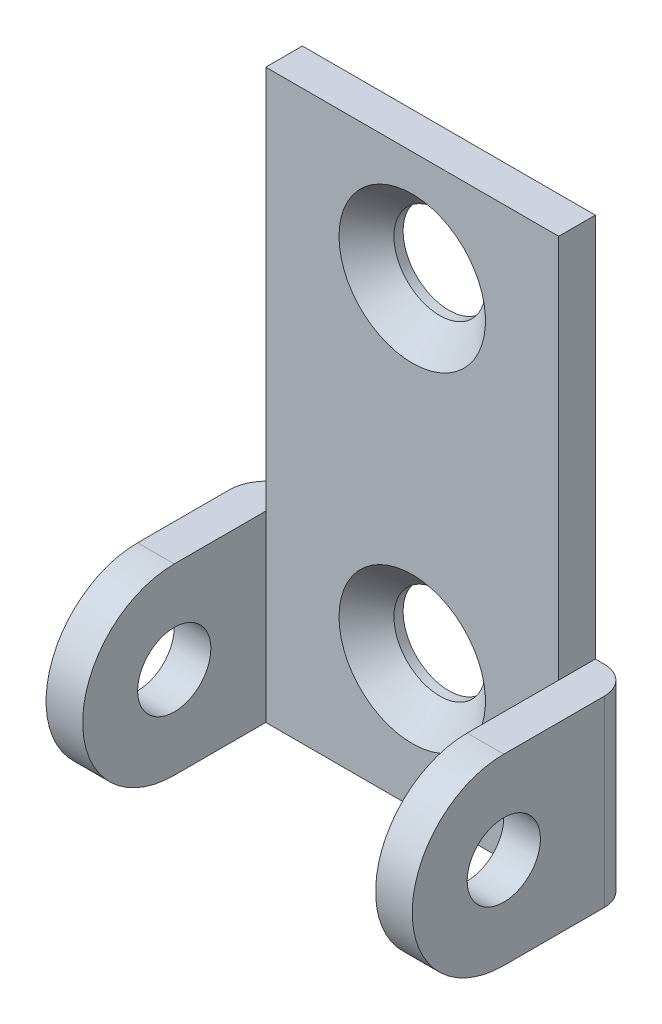
ISO-10303-21;
HEADER;
FILE_DESCRIPTION(('STEP AP214'),'2;1');
FILE_NAME('part.step','',(''),(''),'','','');
FILE_SCHEMA(('AUTOMOTIVE_DESIGN { 1 0 10303 214 1 1 1 1 }'));
ENDSEC;
DATA;
#1=APPLICATION_CONTEXT('core data for automotive mechanical design processes');
#2=APPLICATION_PROTOCOL_DEFINITION('international standard','automotive_design',2000,#1);
#3=PRODUCT_CONTEXT('',#1,'mechanical');
#4=PRODUCT('Part','Part','',(#3));
#5=PRODUCT_RELATED_PRODUCT_CATEGORY('part','',(#4));
#6=PRODUCT_DEFINITION_FORMATION('','',#4);
#7=PRODUCT_DEFINITION_CONTEXT('part definition',#1,'design');
#8=PRODUCT_DEFINITION('design','',#6,#7);
#9=PRODUCT_DEFINITION_SHAPE('','',#8);
#10=(LENGTH_UNIT() NAMED_UNIT(*) SI_UNIT(.MILLI.,.METRE.));
#11=(NAMED_UNIT(*) PLANE_ANGLE_UNIT() SI_UNIT($,.RADIAN.));
#12=(NAMED_UNIT(*) SI_UNIT($,.STERADIAN.) SOLID_ANGLE_UNIT());
#13=UNCERTAINTY_MEASURE_WITH_UNIT(LENGTH_MEASURE(1.E-05),#10,'distance_accuracy_value','');
#14=(GEOMETRIC_REPRESENTATION_CONTEXT(3) GLOBAL_UNCERTAINTY_ASSIGNED_CONTEXT((#13)) GLOBAL_UNIT_ASSIGNED_CONTEXT((#10,
#11,#12)) REPRESENTATION_CONTEXT('',''));
#15=CARTESIAN_POINT('',(0.,0.,0.));
#16=DIRECTION('',(0.,0.,1.));
#17=DIRECTION('',(1.,0.,0.));
#18=AXIS2_PLACEMENT_3D('',#15,#16,#17);
#19=CARTESIAN_POINT('',(2.53130849614536E-13,-1.075139977047E-11,0.));
#20=DIRECTION('',(0.,0.,1.));
#21=DIRECTION('',(1.,0.,0.));
#22=AXIS2_PLACEMENT_3D('',#19,#20,#21);
#23=PLANE('',#22);
#24=CARTESIAN_POINT('',(2.86021202457008E-13,9.49999999998925,0.));
#25=DIRECTION('',(0.,0.,1.));
#26=DIRECTION('',(1.,0.,0.));
#27=AXIS2_PLACEMENT_3D('',#24,#25,#26);
#28=CIRCLE('',#27,2.5);
#29=CARTESIAN_POINT('',(-2.49999999999971,9.49999999998925,0.));
#30=VERTEX_POINT('',#29);
#31=EDGE_CURVE('E213',#30,#30,#28,.T.);
#32=ORIENTED_EDGE('',*,*,#31,.T.);
#33=EDGE_LOOP('',(#32));
#34=FACE_BOUND('',#33,.T.);
#35=CARTESIAN_POINT('',(0.,-8.50000000001075,0.));
#36=DIRECTION('',(0.,0.,1.));
#37=DIRECTION('',(1.,0.,0.));
#38=AXIS2_PLACEMENT_3D('',#35,#36,#37);
#39=CIRCLE('',#38,2.5);
#40=CARTESIAN_POINT('',(-2.5,-8.50000000001075,0.));
#41=VERTEX_POINT('',#40);
#42=EDGE_CURVE('E207',#41,#41,#39,.T.);
#43=ORIENTED_EDGE('',*,*,#42,.T.);
#44=EDGE_LOOP('',(#43));
#45=FACE_BOUND('',#44,.T.);
#46=DIRECTION('',(0.,-1.,0.));
#47=VECTOR('',#46,1.);
#48=CARTESIAN_POINT('',(-7.99999999999975,-2.75000000001075,0.));
#49=LINE('',#48,#47);
#50=CARTESIAN_POINT('',(-7.99999999999975,-5.50000000001075,0.));
#51=VERTEX_POINT('',#50);
#52=CARTESIAN_POINT('',(-7.99999999999975,-15.5000000000108,0.));
#53=VERTEX_POINT('',#52);
#54=EDGE_CURVE('E337',#51,#53,#49,.T.);
#55=ORIENTED_EDGE('',*,*,#54,.F.);
#56=DIRECTION('',(0.,1.,0.));
#57=VECTOR('',#56,1.);
#58=CARTESIAN_POINT('',(-7.99999999999975,-15.5000000000108,0.));
#59=LINE('',#58,#57);
#60=CARTESIAN_POINT('',(-7.99999999999975,15.4999999999892,0.));
#61=VERTEX_POINT('',#60);
#62=EDGE_CURVE('E231',#51,#61,#59,.T.);
#63=ORIENTED_EDGE('',*,*,#62,.T.);
#64=DIRECTION('',(1.,0.,0.));
#65=VECTOR('',#64,1.);
#66=CARTESIAN_POINT('',(-7.99999999999975,15.4999999999892,0.));
#67=LINE('',#66,#65);
#68=CARTESIAN_POINT('',(8.00000000000026,15.4999999999892,0.));
#69=VERTEX_POINT('',#68);
#70=EDGE_CURVE('E52',#61,#69,#67,.T.);
#71=ORIENTED_EDGE('',*,*,#70,.T.);
#72=DIRECTION('',(0.,-1.,0.));
#73=VECTOR('',#72,1.);
#74=CARTESIAN_POINT('',(8.00000000000026,15.4999999999892,0.));
#75=LINE('',#74,#73);
#76=CARTESIAN_POINT('',(8.00000000000026,-5.50000000001075,0.));
#77=VERTEX_POINT('',#76);
#78=EDGE_CURVE('E328',#69,#77,#75,.T.);
#79=ORIENTED_EDGE('',*,*,#78,.T.);
#80=DIRECTION('',(-1.,0.,0.));
#81=VECTOR('',#80,1.);
#82=CARTESIAN_POINT('',(10.0000000000003,-5.50000000001075,0.));
#83=LINE('',#82,#81);
#84=CARTESIAN_POINT('',(8.50000000000026,-5.50000000001075,0.));
#85=VERTEX_POINT('',#84);
#86=EDGE_CURVE('E234',#85,#77,#83,.T.);
#87=ORIENTED_EDGE('',*,*,#86,.F.);
#88=DIRECTION('',(0.,1.,0.));
#89=VECTOR('',#88,1.);
#90=CARTESIAN_POINT('',(8.50000000000026,-7.75000000001075,0.));
#91=LINE('',#90,#89);
#92=CARTESIAN_POINT('',(8.50000000000025,-15.5000000000108,0.));
#93=VERTEX_POINT('',#92);
#94=EDGE_CURVE('E271',#93,#85,#91,.T.);
#95=ORIENTED_EDGE('',*,*,#94,.F.);
#96=DIRECTION('',(-1.,0.,0.));
#97=VECTOR('',#96,1.);
#98=CARTESIAN_POINT('',(-7.99999999999975,-15.5000000000108,0.));
#99=LINE('',#98,#97);
#100=EDGE_CURVE('E301',#93,#53,#99,.T.);
#101=ORIENTED_EDGE('',*,*,#100,.T.);
#102=EDGE_LOOP('',(#55,#63,#71,#79,#87,#95,#101));
#103=FACE_BOUND('',#102,.T.);
#104=ADVANCED_FACE('F41',(#34,#45,#103),#23,.F.);
#105=CARTESIAN_POINT('',(2.53130849614536E-13,-1.075139977047E-11,2.));
#106=DIRECTION('',(0.,0.,1.));
#107=DIRECTION('',(1.,0.,0.));
#108=AXIS2_PLACEMENT_3D('',#105,#106,#107);
#109=PLANE('',#108);
#110=CARTESIAN_POINT('',(2.86021202457008E-13,9.49999999998925,2.));
#111=DIRECTION('',(0.,0.,-1.));
#112=DIRECTION('',(1.,0.,0.));
#113=AXIS2_PLACEMENT_3D('',#110,#111,#112);
#114=CIRCLE('',#113,4.);
#115=CARTESIAN_POINT('',(-3.99999999999971,9.49999999998925,2.));
#116=VERTEX_POINT('',#115);
#117=EDGE_CURVE('E211',#116,#116,#114,.T.);
#118=ORIENTED_EDGE('',*,*,#117,.T.);
#119=EDGE_LOOP('',(#118));
#120=FACE_BOUND('',#119,.T.);
#121=CARTESIAN_POINT('',(0.,-8.50000000001075,2.));
#122=DIRECTION('',(0.,0.,-1.));
#123=DIRECTION('',(1.,0.,0.));
#124=AXIS2_PLACEMENT_3D('',#121,#122,#123);
#125=CIRCLE('',#124,4.);
#126=CARTESIAN_POINT('',(-4.,-8.50000000001075,2.));
#127=VERTEX_POINT('',#126);
#128=EDGE_CURVE('E196',#127,#127,#125,.T.);
#129=ORIENTED_EDGE('',*,*,#128,.T.);
#130=EDGE_LOOP('',(#129));
#131=FACE_BOUND('',#130,.T.);
#132=DIRECTION('',(-1.,0.,0.));
#133=VECTOR('',#132,1.);
#134=CARTESIAN_POINT('',(-7.99999999999975,15.4999999999892,2.));
#135=LINE('',#134,#133);
#136=CARTESIAN_POINT('',(8.00000000000026,15.4999999999892,2.));
#137=VERTEX_POINT('',#136);
#138=CARTESIAN_POINT('',(-7.99999999999975,15.4999999999892,2.));
#139=VERTEX_POINT('',#138);
#140=EDGE_CURVE('E11',#137,#139,#135,.T.);
#141=ORIENTED_EDGE('',*,*,#140,.T.);
#142=DIRECTION('',(0.,-1.,0.));
#143=VECTOR('',#142,1.);
#144=CARTESIAN_POINT('',(-7.99999999999975,-15.5000000000108,2.));
#145=LINE('',#144,#143);
#146=CARTESIAN_POINT('',(-7.99999999999975,-5.50000000001075,2.));
#147=VERTEX_POINT('',#146);
#148=EDGE_CURVE('E182',#139,#147,#145,.T.);
#149=ORIENTED_EDGE('',*,*,#148,.T.);
#150=DIRECTION('',(0.,-1.,0.));
#151=VECTOR('',#150,1.);
#152=CARTESIAN_POINT('',(-7.99999999999975,-15.5000000000108,2.));
#153=LINE('',#152,#151);
#154=CARTESIAN_POINT('',(-7.99999999999975,-15.5000000000108,2.));
#155=VERTEX_POINT('',#154);
#156=EDGE_CURVE('E159',#147,#155,#153,.T.);
#157=ORIENTED_EDGE('',*,*,#156,.T.);
#158=DIRECTION('',(1.,0.,0.));
#159=VECTOR('',#158,1.);
#160=CARTESIAN_POINT('',(8.00000000000026,-15.5000000000108,2.));
#161=LINE('',#160,#159);
#162=CARTESIAN_POINT('',(8.00000000000026,-15.5000000000108,2.));
#163=VERTEX_POINT('',#162);
#164=EDGE_CURVE('E170',#155,#163,#161,.T.);
#165=ORIENTED_EDGE('',*,*,#164,.T.);
#166=DIRECTION('',(0.,1.,0.));
#167=VECTOR('',#166,1.);
#168=CARTESIAN_POINT('',(8.00000000000026,15.4999999999892,2.));
#169=LINE('',#168,#167);
#170=CARTESIAN_POINT('',(8.00000000000026,-5.50000000001075,2.));
#171=VERTEX_POINT('',#170);
#172=EDGE_CURVE('E274',#163,#171,#169,.T.);
#173=ORIENTED_EDGE('',*,*,#172,.T.);
#174=DIRECTION('',(0.,1.,0.));
#175=VECTOR('',#174,1.);
#176=CARTESIAN_POINT('',(8.00000000000026,15.4999999999892,2.));
#177=LINE('',#176,#175);
#178=EDGE_CURVE('E192',#171,#137,#177,.T.);
#179=ORIENTED_EDGE('',*,*,#178,.T.);
#180=EDGE_LOOP('',(#141,#149,#157,#165,#173,#179));
#181=FACE_BOUND('',#180,.T.);
#182=ADVANCED_FACE('F181',(#120,#131,#181),#109,.T.);
#183=CARTESIAN_POINT('',(8.00000000000026,15.4999999999892,0.));
#184=DIRECTION('',(0.,1.,0.));
#185=DIRECTION('',(1.,0.,0.));
#186=AXIS2_PLACEMENT_3D('',#183,#184,#185);
#187=PLANE('',#186);
#188=ORIENTED_EDGE('',*,*,#70,.F.);
#189=DIRECTION('',(0.,0.,1.));
#190=VECTOR('',#189,1.);
#191=CARTESIAN_POINT('',(-7.99999999999975,15.4999999999892,0.));
#192=LINE('',#191,#190);
#193=EDGE_CURVE('E61',#61,#139,#192,.T.);
#194=ORIENTED_EDGE('',*,*,#193,.T.);
#195=ORIENTED_EDGE('',*,*,#140,.F.);
#196=DIRECTION('',(0.,0.,1.));
#197=VECTOR('',#196,1.);
#198=CARTESIAN_POINT('',(8.00000000000026,15.4999999999892,0.));
#199=LINE('',#198,#197);
#200=EDGE_CURVE('E197',#69,#137,#199,.T.);
#201=ORIENTED_EDGE('',*,*,#200,.F.);
#202=EDGE_LOOP('',(#188,#194,#195,#201));
#203=FACE_BOUND('',#202,.T.);
#204=ADVANCED_FACE('F392',(#203),#187,.T.);
#205=CARTESIAN_POINT('',(-7.99999999999975,15.4999999999892,0.));
#206=DIRECTION('',(-1.,0.,0.));
#207=DIRECTION('',(0.,0.,1.));
#208=AXIS2_PLACEMENT_3D('',#205,#206,#207);
#209=PLANE('',#208);
#210=DIRECTION('',(0.,0.,1.));
#211=VECTOR('',#210,1.);
#212=CARTESIAN_POINT('',(-7.99999999999975,-5.50000000001075,0.));
#213=LINE('',#212,#211);
#214=EDGE_CURVE('E288',#51,#147,#213,.T.);
#215=ORIENTED_EDGE('',*,*,#214,.T.);
#216=ORIENTED_EDGE('',*,*,#148,.F.);
#217=ORIENTED_EDGE('',*,*,#193,.F.);
#218=ORIENTED_EDGE('',*,*,#62,.F.);
#219=EDGE_LOOP('',(#215,#216,#217,#218));
#220=FACE_BOUND('',#219,.T.);
#221=ADVANCED_FACE('F43',(#220),#209,.T.);
#222=CARTESIAN_POINT('',(2.86021202457008E-13,9.49999999998925,-8.5));
#223=DIRECTION('',(0.,0.,-1.));
#224=DIRECTION('',(1.,0.,0.));
#225=AXIS2_PLACEMENT_3D('',#222,#223,#224);
#226=CYLINDRICAL_SURFACE('',#225,2.5);
#227=CARTESIAN_POINT('',(2.86021202457008E-13,9.49999999998925,0.5));
#228=DIRECTION('',(0.,0.,-1.));
#229=DIRECTION('',(1.,0.,0.));
#230=AXIS2_PLACEMENT_3D('',#227,#228,#229);
#231=CIRCLE('',#230,2.5);
#232=CARTESIAN_POINT('',(-2.49999999999971,9.49999999998925,0.5));
#233=VERTEX_POINT('',#232);
#234=EDGE_CURVE('E250',#233,#233,#231,.T.);
#235=ORIENTED_EDGE('',*,*,#234,.F.);
#236=DIRECTION('',(0.,0.,-1.));
#237=VECTOR('',#236,1.);
#238=CARTESIAN_POINT('',(-2.49999999999971,9.49999999998925,-8.5));
#239=LINE('',#238,#237);
#240=EDGE_CURVE('E217',#233,#30,#239,.T.);
#241=ORIENTED_EDGE('',*,*,#240,.T.);
#242=ORIENTED_EDGE('',*,*,#31,.F.);
#243=ORIENTED_EDGE('',*,*,#240,.F.);
#244=EDGE_LOOP('',(#235,#241,#242,#243));
#245=FACE_BOUND('',#244,.T.);
#246=ADVANCED_FACE('F456',(#245),#226,.F.);
#247=CARTESIAN_POINT('',(2.86021202457008E-13,9.49999999998925,1.25));
#248=DIRECTION('',(0.,0.,1.));
#249=DIRECTION('',(1.,0.,0.));
#250=AXIS2_PLACEMENT_3D('',#247,#248,#249);
#251=CONICAL_SURFACE('',#250,3.25,0.785398163397448);
#252=ORIENTED_EDGE('',*,*,#117,.F.);
#253=DIRECTION('',(0.707106781186547,0.,-0.707106781186548));
#254=VECTOR('',#253,1.);
#255=CARTESIAN_POINT('',(-3.24999999999971,9.49999999998925,1.25));
#256=LINE('',#255,#254);
#257=EDGE_CURVE('E190',#116,#233,#256,.T.);
#258=ORIENTED_EDGE('',*,*,#257,.T.);
#259=ORIENTED_EDGE('',*,*,#234,.T.);
#260=ORIENTED_EDGE('',*,*,#257,.F.);
#261=EDGE_LOOP('',(#252,#258,#259,#260));
#262=FACE_BOUND('',#261,.T.);
#263=ADVANCED_FACE('F436',(#262),#251,.F.);
#264=CARTESIAN_POINT('',(0.,-8.50000000001075,-8.5));
#265=DIRECTION('',(0.,0.,-1.));
#266=DIRECTION('',(1.,0.,0.));
#267=AXIS2_PLACEMENT_3D('',#264,#265,#266);
#268=CYLINDRICAL_SURFACE('',#267,2.5);
#269=CARTESIAN_POINT('',(0.,-8.50000000001075,0.5));
#270=DIRECTION('',(0.,0.,-1.));
#271=DIRECTION('',(1.,0.,0.));
#272=AXIS2_PLACEMENT_3D('',#269,#270,#271);
#273=CIRCLE('',#272,2.5);
#274=CARTESIAN_POINT('',(-2.5,-8.50000000001075,0.5));
#275=VERTEX_POINT('',#274);
#276=EDGE_CURVE('E243',#275,#275,#273,.T.);
#277=ORIENTED_EDGE('',*,*,#276,.F.);
#278=DIRECTION('',(0.,0.,-1.));
#279=VECTOR('',#278,1.);
#280=CARTESIAN_POINT('',(-2.5,-8.50000000001075,-8.5));
#281=LINE('',#280,#279);
#282=EDGE_CURVE('E212',#275,#41,#281,.T.);
#283=ORIENTED_EDGE('',*,*,#282,.T.);
#284=ORIENTED_EDGE('',*,*,#42,.F.);
#285=ORIENTED_EDGE('',*,*,#282,.F.);
#286=EDGE_LOOP('',(#277,#283,#284,#285));
#287=FACE_BOUND('',#286,.T.);
#288=ADVANCED_FACE('F440',(#287),#268,.F.);
#289=CARTESIAN_POINT('',(0.,-8.50000000001075,1.25));
#290=DIRECTION('',(0.,0.,1.));
#291=DIRECTION('',(1.,0.,0.));
#292=AXIS2_PLACEMENT_3D('',#289,#290,#291);
#293=CONICAL_SURFACE('',#292,3.25,0.785398163397448);
#294=ORIENTED_EDGE('',*,*,#128,.F.);
#295=DIRECTION('',(0.707106781186547,0.,-0.707106781186548));
#296=VECTOR('',#295,1.);
#297=CARTESIAN_POINT('',(-3.25,-8.50000000001075,1.25));
#298=LINE('',#297,#296);
#299=EDGE_CURVE('E240',#127,#275,#298,.T.);
#300=ORIENTED_EDGE('',*,*,#299,.T.);
#301=ORIENTED_EDGE('',*,*,#276,.T.);
#302=ORIENTED_EDGE('',*,*,#299,.F.);
#303=EDGE_LOOP('',(#294,#300,#301,#302));
#304=FACE_BOUND('',#303,.T.);
#305=ADVANCED_FACE('F438',(#304),#293,.F.);
#306=CARTESIAN_POINT('',(8.00000000000026,-15.5000000000108,0.));
#307=DIRECTION('',(1.,0.,0.));
#308=DIRECTION('',(0.,1.,0.));
#309=AXIS2_PLACEMENT_3D('',#306,#307,#308);
#310=PLANE('',#309);
#311=DIRECTION('',(0.,0.,-1.));
#312=VECTOR('',#311,1.);
#313=CARTESIAN_POINT('',(8.00000000000026,-5.50000000001075,0.));
#314=LINE('',#313,#312);
#315=EDGE_CURVE('E238',#171,#77,#314,.T.);
#316=ORIENTED_EDGE('',*,*,#315,.T.);
#317=ORIENTED_EDGE('',*,*,#78,.F.);
#318=ORIENTED_EDGE('',*,*,#200,.T.);
#319=ORIENTED_EDGE('',*,*,#178,.F.);
#320=EDGE_LOOP('',(#316,#317,#318,#319));
#321=FACE_BOUND('',#320,.T.);
#322=ADVANCED_FACE('F389',(#321),#310,.T.);
#323=CARTESIAN_POINT('',(10.0000000000003,-5.50000000001075,0.));
#324=DIRECTION('',(0.,1.,0.));
#325=DIRECTION('',(1.,0.,0.));
#326=AXIS2_PLACEMENT_3D('',#323,#324,#325);
#327=PLANE('',#326);
#328=DIRECTION('',(-1.,0.,0.));
#329=VECTOR('',#328,1.);
#330=CARTESIAN_POINT('',(9.50000000000026,-5.50000000001075,7.));
#331=LINE('',#330,#329);
#332=CARTESIAN_POINT('',(10.0000000000003,-5.50000000001075,7.));
#333=VERTEX_POINT('',#332);
#334=CARTESIAN_POINT('',(8.00000000000026,-5.50000000001075,7.));
#335=VERTEX_POINT('',#334);
#336=EDGE_CURVE('E256',#333,#335,#331,.T.);
#337=ORIENTED_EDGE('',*,*,#336,.F.);
#338=DIRECTION('',(0.,0.,1.));
#339=VECTOR('',#338,1.);
#340=CARTESIAN_POINT('',(10.0000000000003,-5.50000000001075,0.));
#341=LINE('',#340,#339);
#342=CARTESIAN_POINT('',(10.0000000000003,-5.50000000001075,1.5));
#343=VERTEX_POINT('',#342);
#344=EDGE_CURVE('E239',#343,#333,#341,.T.);
#345=ORIENTED_EDGE('',*,*,#344,.F.);
#346=CARTESIAN_POINT('',(8.50000000000026,-5.50000000001075,1.5));
#347=DIRECTION('',(0.,-1.,0.));
#348=DIRECTION('',(0.707106781186548,0.,-0.707106781186547));
#349=AXIS2_PLACEMENT_3D('',#346,#347,#348);
#350=CIRCLE('',#349,1.5);
#351=EDGE_CURVE('E178',#85,#343,#350,.T.);
#352=ORIENTED_EDGE('',*,*,#351,.F.);
#353=ORIENTED_EDGE('',*,*,#86,.T.);
#354=ORIENTED_EDGE('',*,*,#315,.F.);
#355=DIRECTION('',(0.,0.,1.));
#356=VECTOR('',#355,1.);
#357=CARTESIAN_POINT('',(8.00000000000026,-5.50000000001075,0.));
#358=LINE('',#357,#356);
#359=EDGE_CURVE('E187',#171,#335,#358,.T.);
#360=ORIENTED_EDGE('',*,*,#359,.T.);
#361=EDGE_LOOP('',(#337,#345,#352,#353,#354,#360));
#362=FACE_BOUND('',#361,.T.);
#363=ADVANCED_FACE('F363',(#362),#327,.T.);
#364=CARTESIAN_POINT('',(10.0000000000003,-15.5000000000108,0.));
#365=DIRECTION('',(1.,0.,0.));
#366=DIRECTION('',(0.,1.,0.));
#367=AXIS2_PLACEMENT_3D('',#364,#365,#366);
#368=PLANE('',#367);
#369=CARTESIAN_POINT('',(10.0000000000003,-10.5000000000108,7.));
#370=DIRECTION('',(-1.,0.,0.));
#371=DIRECTION('',(0.,1.,0.));
#372=AXIS2_PLACEMENT_3D('',#369,#370,#371);
#373=CIRCLE('',#372,2.);
#374=CARTESIAN_POINT('',(10.0000000000003,-12.5000000000108,7.));
#375=VERTEX_POINT('',#374);
#376=EDGE_CURVE('E260',#375,#375,#373,.T.);
#377=ORIENTED_EDGE('',*,*,#376,.T.);
#378=EDGE_LOOP('',(#377));
#379=FACE_BOUND('',#378,.T.);
#380=CARTESIAN_POINT('',(10.0000000000003,-10.5000000000108,7.));
#381=DIRECTION('',(-1.,0.,0.));
#382=DIRECTION('',(0.,0.707106781186548,0.707106781186548));
#383=AXIS2_PLACEMENT_3D('',#380,#381,#382);
#384=CIRCLE('',#383,5.);
#385=CARTESIAN_POINT('',(10.0000000000003,-15.5000000000108,7.));
#386=VERTEX_POINT('',#385);
#387=EDGE_CURVE('E221',#386,#333,#384,.T.);
#388=ORIENTED_EDGE('',*,*,#387,.F.);
#389=DIRECTION('',(0.,0.,1.));
#390=VECTOR('',#389,1.);
#391=CARTESIAN_POINT('',(10.0000000000003,-15.5000000000108,0.));
#392=LINE('',#391,#390);
#393=CARTESIAN_POINT('',(10.0000000000003,-15.5000000000108,1.5));
#394=VERTEX_POINT('',#393);
#395=EDGE_CURVE('E179',#394,#386,#392,.T.);
#396=ORIENTED_EDGE('',*,*,#395,.F.);
#397=DIRECTION('',(0.,-1.,0.));
#398=VECTOR('',#397,1.);
#399=CARTESIAN_POINT('',(10.0000000000003,-7.75000000001075,1.5));
#400=LINE('',#399,#398);
#401=EDGE_CURVE('E277',#343,#394,#400,.T.);
#402=ORIENTED_EDGE('',*,*,#401,.F.);
#403=ORIENTED_EDGE('',*,*,#344,.T.);
#404=EDGE_LOOP('',(#388,#396,#402,#403));
#405=FACE_BOUND('',#404,.T.);
#406=ADVANCED_FACE('F359',(#379,#405),#368,.T.);
#407=CARTESIAN_POINT('',(8.50000000000026,-7.75000000001075,1.5));
#408=DIRECTION('',(0.,1.,0.));
#409=DIRECTION('',(0.707106781186548,0.,-0.707106781186547));
#410=AXIS2_PLACEMENT_3D('',#407,#408,#409);
#411=CYLINDRICAL_SURFACE('',#410,1.5);
#412=ORIENTED_EDGE('',*,*,#351,.T.);
#413=ORIENTED_EDGE('',*,*,#401,.T.);
#414=CARTESIAN_POINT('',(8.50000000000026,-15.5000000000108,1.5));
#415=DIRECTION('',(0.,1.,0.));
#416=DIRECTION('',(0.707106781186548,0.,-0.707106781186547));
#417=AXIS2_PLACEMENT_3D('',#414,#415,#416);
#418=CIRCLE('',#417,1.5);
#419=EDGE_CURVE('E206',#394,#93,#418,.T.);
#420=ORIENTED_EDGE('',*,*,#419,.T.);
#421=ORIENTED_EDGE('',*,*,#94,.T.);
#422=EDGE_LOOP('',(#412,#413,#420,#421));
#423=FACE_BOUND('',#422,.T.);
#424=ADVANCED_FACE('F362',(#423),#411,.T.);
#425=CARTESIAN_POINT('',(-7.99999999999975,-15.5000000000108,0.));
#426=DIRECTION('',(0.,-1.,0.));
#427=DIRECTION('',(0.,0.,-1.));
#428=AXIS2_PLACEMENT_3D('',#425,#426,#427);
#429=PLANE('',#428);
#430=DIRECTION('',(1.,0.,0.));
#431=VECTOR('',#430,1.);
#432=CARTESIAN_POINT('',(-8.49999999999975,-15.5000000000108,7.));
#433=LINE('',#432,#431);
#434=CARTESIAN_POINT('',(-9.99999999999975,-15.5000000000108,7.));
#435=VERTEX_POINT('',#434);
#436=CARTESIAN_POINT('',(-7.99999999999975,-15.5000000000108,7.));
#437=VERTEX_POINT('',#436);
#438=EDGE_CURVE('E226',#435,#437,#433,.T.);
#439=ORIENTED_EDGE('',*,*,#438,.F.);
#440=DIRECTION('',(0.,0.,1.));
#441=VECTOR('',#440,1.);
#442=CARTESIAN_POINT('',(-9.99999999999975,-15.5000000000108,0.));
#443=LINE('',#442,#441);
#444=CARTESIAN_POINT('',(-9.99999999999975,-15.5000000000108,2.));
#445=VERTEX_POINT('',#444);
#446=EDGE_CURVE('E222',#445,#435,#443,.T.);
#447=ORIENTED_EDGE('',*,*,#446,.F.);
#448=CARTESIAN_POINT('',(-7.99999999999975,-15.5000000000108,2.));
#449=DIRECTION('',(0.,1.,0.));
#450=DIRECTION('',(-0.707106781186547,0.,-0.707106781186548));
#451=AXIS2_PLACEMENT_3D('',#448,#449,#450);
#452=CIRCLE('',#451,2.);
#453=EDGE_CURVE('E308',#53,#445,#452,.T.);
#454=ORIENTED_EDGE('',*,*,#453,.F.);
#455=ORIENTED_EDGE('',*,*,#100,.F.);
#456=ORIENTED_EDGE('',*,*,#419,.F.);
#457=ORIENTED_EDGE('',*,*,#395,.T.);
#458=DIRECTION('',(1.,0.,0.));
#459=VECTOR('',#458,1.);
#460=CARTESIAN_POINT('',(0.500000000000253,-15.5000000000108,7.));
#461=LINE('',#460,#459);
#462=CARTESIAN_POINT('',(8.00000000000026,-15.5000000000108,7.));
#463=VERTEX_POINT('',#462);
#464=EDGE_CURVE('E218',#463,#386,#461,.T.);
#465=ORIENTED_EDGE('',*,*,#464,.F.);
#466=DIRECTION('',(0.,0.,1.));
#467=VECTOR('',#466,1.);
#468=CARTESIAN_POINT('',(8.00000000000026,-15.5000000000108,0.));
#469=LINE('',#468,#467);
#470=EDGE_CURVE('E173',#163,#463,#469,.T.);
#471=ORIENTED_EDGE('',*,*,#470,.F.);
#472=ORIENTED_EDGE('',*,*,#164,.F.);
#473=DIRECTION('',(0.,0.,1.));
#474=VECTOR('',#473,1.);
#475=CARTESIAN_POINT('',(-7.99999999999975,-15.5000000000108,0.));
#476=LINE('',#475,#474);
#477=EDGE_CURVE('E154',#155,#437,#476,.T.);
#478=ORIENTED_EDGE('',*,*,#477,.T.);
#479=EDGE_LOOP('',(#439,#447,#454,#455,#456,#457,#465,#471,#472,#478));
#480=FACE_BOUND('',#479,.T.);
#481=ADVANCED_FACE('F171',(#480),#429,.T.);
#482=CARTESIAN_POINT('',(-7.99999999999975,-2.75000000001075,2.));
#483=DIRECTION('',(0.,1.,0.));
#484=DIRECTION('',(-0.707106781186547,0.,-0.707106781186548));
#485=AXIS2_PLACEMENT_3D('',#482,#483,#484);
#486=CYLINDRICAL_SURFACE('',#485,2.);
#487=ORIENTED_EDGE('',*,*,#453,.T.);
#488=DIRECTION('',(0.,1.,0.));
#489=VECTOR('',#488,1.);
#490=CARTESIAN_POINT('',(-9.99999999999975,-2.75000000001075,2.));
#491=LINE('',#490,#489);
#492=CARTESIAN_POINT('',(-9.99999999999975,-5.50000000001075,2.));
#493=VERTEX_POINT('',#492);
#494=EDGE_CURVE('E227',#445,#493,#491,.T.);
#495=ORIENTED_EDGE('',*,*,#494,.T.);
#496=CARTESIAN_POINT('',(-7.99999999999975,-5.50000000001075,2.));
#497=DIRECTION('',(0.,-1.,0.));
#498=DIRECTION('',(-0.707106781186547,0.,-0.707106781186548));
#499=AXIS2_PLACEMENT_3D('',#496,#497,#498);
#500=CIRCLE('',#499,2.);
#501=EDGE_CURVE('E167',#493,#51,#500,.T.);
#502=ORIENTED_EDGE('',*,*,#501,.T.);
#503=ORIENTED_EDGE('',*,*,#54,.T.);
#504=EDGE_LOOP('',(#487,#495,#502,#503));
#505=FACE_BOUND('',#504,.T.);
#506=ADVANCED_FACE('F404',(#505),#486,.T.);
#507=CARTESIAN_POINT('',(9.50000000000026,-10.5000000000108,7.));
#508=DIRECTION('',(-1.,0.,0.));
#509=DIRECTION('',(0.,0.707106781186548,0.707106781186548));
#510=AXIS2_PLACEMENT_3D('',#507,#508,#509);
#511=CYLINDRICAL_SURFACE('',#510,5.);
#512=CARTESIAN_POINT('',(8.00000000000026,-10.5000000000108,7.));
#513=DIRECTION('',(1.,0.,0.));
#514=DIRECTION('',(0.,-0.707106781186548,0.707106781186548));
#515=AXIS2_PLACEMENT_3D('',#512,#513,#514);
#516=CIRCLE('',#515,5.);
#517=EDGE_CURVE('E45',#335,#463,#516,.T.);
#518=ORIENTED_EDGE('',*,*,#517,.T.);
#519=ORIENTED_EDGE('',*,*,#464,.T.);
#520=ORIENTED_EDGE('',*,*,#387,.T.);
#521=ORIENTED_EDGE('',*,*,#336,.T.);
#522=EDGE_LOOP('',(#518,#519,#520,#521));
#523=FACE_BOUND('',#522,.T.);
#524=ADVANCED_FACE('F371',(#523),#511,.T.);
#525=CARTESIAN_POINT('',(8.00000000000026,-5.50000000001075,0.));
#526=DIRECTION('',(-1.,0.,0.));
#527=DIRECTION('',(0.,0.,1.));
#528=AXIS2_PLACEMENT_3D('',#525,#526,#527);
#529=PLANE('',#528);
#530=CARTESIAN_POINT('',(8.00000000000026,-10.5000000000108,7.));
#531=DIRECTION('',(1.,0.,0.));
#532=DIRECTION('',(0.,1.,0.));
#533=AXIS2_PLACEMENT_3D('',#530,#531,#532);
#534=CIRCLE('',#533,2.);
#535=CARTESIAN_POINT('',(8.00000000000026,-12.5000000000108,7.));
#536=VERTEX_POINT('',#535);
#537=EDGE_CURVE('E267',#536,#536,#534,.T.);
#538=ORIENTED_EDGE('',*,*,#537,.T.);
#539=EDGE_LOOP('',(#538));
#540=FACE_BOUND('',#539,.T.);
#541=ORIENTED_EDGE('',*,*,#517,.F.);
#542=ORIENTED_EDGE('',*,*,#359,.F.);
#543=ORIENTED_EDGE('',*,*,#172,.F.);
#544=ORIENTED_EDGE('',*,*,#470,.T.);
#545=EDGE_LOOP('',(#541,#542,#543,#544));
#546=FACE_BOUND('',#545,.T.);
#547=ADVANCED_FACE('F354',(#540,#546),#529,.T.);
#548=CARTESIAN_POINT('',(-7.99999999999975,-15.5000000000108,0.));
#549=DIRECTION('',(1.,0.,0.));
#550=DIRECTION('',(0.,1.,0.));
#551=AXIS2_PLACEMENT_3D('',#548,#549,#550);
#552=PLANE('',#551);
#553=CARTESIAN_POINT('',(-7.99999999999975,-10.5000000000108,7.));
#554=DIRECTION('',(-1.,0.,0.));
#555=DIRECTION('',(0.,1.,0.));
#556=AXIS2_PLACEMENT_3D('',#553,#554,#555);
#557=CIRCLE('',#556,2.);
#558=CARTESIAN_POINT('',(-7.99999999999975,-12.5000000000108,7.));
#559=VERTEX_POINT('',#558);
#560=EDGE_CURVE('E294',#559,#559,#557,.T.);
#561=ORIENTED_EDGE('',*,*,#560,.T.);
#562=EDGE_LOOP('',(#561));
#563=FACE_BOUND('',#562,.T.);
#564=CARTESIAN_POINT('',(-7.99999999999975,-10.5000000000108,7.));
#565=DIRECTION('',(-1.,0.,0.));
#566=DIRECTION('',(0.,0.707106781186548,0.707106781186548));
#567=AXIS2_PLACEMENT_3D('',#564,#565,#566);
#568=CIRCLE('',#567,5.);
#569=CARTESIAN_POINT('',(-7.99999999999975,-5.50000000001075,7.));
#570=VERTEX_POINT('',#569);
#571=EDGE_CURVE('E162',#437,#570,#568,.T.);
#572=ORIENTED_EDGE('',*,*,#571,.F.);
#573=ORIENTED_EDGE('',*,*,#477,.F.);
#574=ORIENTED_EDGE('',*,*,#156,.F.);
#575=DIRECTION('',(0.,0.,1.));
#576=VECTOR('',#575,1.);
#577=CARTESIAN_POINT('',(-7.99999999999975,-5.50000000001075,0.));
#578=LINE('',#577,#576);
#579=EDGE_CURVE('E202',#147,#570,#578,.T.);
#580=ORIENTED_EDGE('',*,*,#579,.T.);
#581=EDGE_LOOP('',(#572,#573,#574,#580));
#582=FACE_BOUND('',#581,.T.);
#583=ADVANCED_FACE('F156',(#563,#582),#552,.T.);
#584=CARTESIAN_POINT('',(-7.99999999999975,-5.50000000001075,0.));
#585=DIRECTION('',(0.,1.,0.));
#586=DIRECTION('',(1.,0.,0.));
#587=AXIS2_PLACEMENT_3D('',#584,#585,#586);
#588=PLANE('',#587);
#589=DIRECTION('',(-1.,0.,0.));
#590=VECTOR('',#589,1.);
#591=CARTESIAN_POINT('',(-8.49999999999975,-5.50000000001075,7.));
#592=LINE('',#591,#590);
#593=CARTESIAN_POINT('',(-9.99999999999975,-5.50000000001075,7.));
#594=VERTEX_POINT('',#593);
#595=EDGE_CURVE('E198',#570,#594,#592,.T.);
#596=ORIENTED_EDGE('',*,*,#595,.F.);
#597=ORIENTED_EDGE('',*,*,#579,.F.);
#598=ORIENTED_EDGE('',*,*,#214,.F.);
#599=ORIENTED_EDGE('',*,*,#501,.F.);
#600=DIRECTION('',(0.,0.,1.));
#601=VECTOR('',#600,1.);
#602=CARTESIAN_POINT('',(-9.99999999999975,-5.50000000001075,0.));
#603=LINE('',#602,#601);
#604=EDGE_CURVE('E281',#493,#594,#603,.T.);
#605=ORIENTED_EDGE('',*,*,#604,.T.);
#606=EDGE_LOOP('',(#596,#597,#598,#599,#605));
#607=FACE_BOUND('',#606,.T.);
#608=ADVANCED_FACE('F397',(#607),#588,.T.);
#609=CARTESIAN_POINT('',(-8.49999999999975,-10.5000000000108,7.));
#610=DIRECTION('',(-1.,0.,0.));
#611=DIRECTION('',(0.,0.707106781186548,0.707106781186548));
#612=AXIS2_PLACEMENT_3D('',#609,#610,#611);
#613=CYLINDRICAL_SURFACE('',#612,5.);
#614=CARTESIAN_POINT('',(-9.99999999999975,-10.5000000000108,7.));
#615=DIRECTION('',(1.,0.,0.));
#616=DIRECTION('',(0.,-0.707106781186548,0.707106781186548));
#617=AXIS2_PLACEMENT_3D('',#614,#615,#616);
#618=CIRCLE('',#617,5.);
#619=EDGE_CURVE('E285',#594,#435,#618,.T.);
#620=ORIENTED_EDGE('',*,*,#619,.T.);
#621=ORIENTED_EDGE('',*,*,#438,.T.);
#622=ORIENTED_EDGE('',*,*,#571,.T.);
#623=ORIENTED_EDGE('',*,*,#595,.T.);
#624=EDGE_LOOP('',(#620,#621,#622,#623));
#625=FACE_BOUND('',#624,.T.);
#626=ADVANCED_FACE('F399',(#625),#613,.T.);
#627=CARTESIAN_POINT('',(-9.99999999999975,-5.50000000001075,0.));
#628=DIRECTION('',(-1.,0.,0.));
#629=DIRECTION('',(0.,0.,1.));
#630=AXIS2_PLACEMENT_3D('',#627,#628,#629);
#631=PLANE('',#630);
#632=CARTESIAN_POINT('',(-9.99999999999975,-10.5000000000108,7.));
#633=DIRECTION('',(1.,0.,0.));
#634=DIRECTION('',(0.,1.,0.));
#635=AXIS2_PLACEMENT_3D('',#632,#633,#634);
#636=CIRCLE('',#635,2.);
#637=CARTESIAN_POINT('',(-9.99999999999975,-12.5000000000108,7.));
#638=VERTEX_POINT('',#637);
#639=EDGE_CURVE('E311',#638,#638,#636,.T.);
#640=ORIENTED_EDGE('',*,*,#639,.T.);
#641=EDGE_LOOP('',(#640));
#642=FACE_BOUND('',#641,.T.);
#643=ORIENTED_EDGE('',*,*,#619,.F.);
#644=ORIENTED_EDGE('',*,*,#604,.F.);
#645=ORIENTED_EDGE('',*,*,#494,.F.);
#646=ORIENTED_EDGE('',*,*,#446,.T.);
#647=EDGE_LOOP('',(#643,#644,#645,#646));
#648=FACE_BOUND('',#647,.T.);
#649=ADVANCED_FACE('F402',(#642,#648),#631,.T.);
#650=CARTESIAN_POINT('',(-0.999999999999748,-10.5000000000108,7.));
#651=DIRECTION('',(-1.,0.,0.));
#652=DIRECTION('',(0.,1.,0.));
#653=AXIS2_PLACEMENT_3D('',#650,#651,#652);
#654=CYLINDRICAL_SURFACE('',#653,2.);
#655=ORIENTED_EDGE('',*,*,#560,.F.);
#656=DIRECTION('',(-1.,0.,0.));
#657=VECTOR('',#656,1.);
#658=CARTESIAN_POINT('',(-0.999999999999748,-12.5000000000108,7.));
#659=LINE('',#658,#657);
#660=EDGE_CURVE('E298',#559,#638,#659,.T.);
#661=ORIENTED_EDGE('',*,*,#660,.T.);
#662=ORIENTED_EDGE('',*,*,#639,.F.);
#663=ORIENTED_EDGE('',*,*,#660,.F.);
#664=EDGE_LOOP('',(#655,#661,#662,#663));
#665=FACE_BOUND('',#664,.T.);
#666=ADVANCED_FACE('F462',(#665),#654,.F.);
#667=CARTESIAN_POINT('',(-0.999999999999748,-10.5000000000108,7.));
#668=DIRECTION('',(-1.,0.,0.));
#669=DIRECTION('',(0.,1.,0.));
#670=AXIS2_PLACEMENT_3D('',#667,#668,#669);
#671=CYLINDRICAL_SURFACE('',#670,2.);
#672=ORIENTED_EDGE('',*,*,#376,.F.);
#673=DIRECTION('',(-1.,0.,0.));
#674=VECTOR('',#673,1.);
#675=CARTESIAN_POINT('',(-0.999999999999748,-12.5000000000108,7.));
#676=LINE('',#675,#674);
#677=EDGE_CURVE('E264',#375,#536,#676,.T.);
#678=ORIENTED_EDGE('',*,*,#677,.T.);
#679=ORIENTED_EDGE('',*,*,#537,.F.);
#680=ORIENTED_EDGE('',*,*,#677,.F.);
#681=EDGE_LOOP('',(#672,#678,#679,#680));
#682=FACE_BOUND('',#681,.T.);
#683=ADVANCED_FACE('F357',(#682),#671,.F.);
#684=CLOSED_SHELL('',(#104,#182,#204,#221,#246,#263,#288,#305,#322,#363,#406,#424,#481,#506,
#524,#547,#583,#608,#626,#649,#666,#683));
#685=MANIFOLD_SOLID_BREP('B2',#684);
#686=ADVANCED_BREP_SHAPE_REPRESENTATION('',(#18,#685),#14);
#687=SHAPE_DEFINITION_REPRESENTATION(#9,#686);
ENDSEC;
END-ISO-10303-21;
